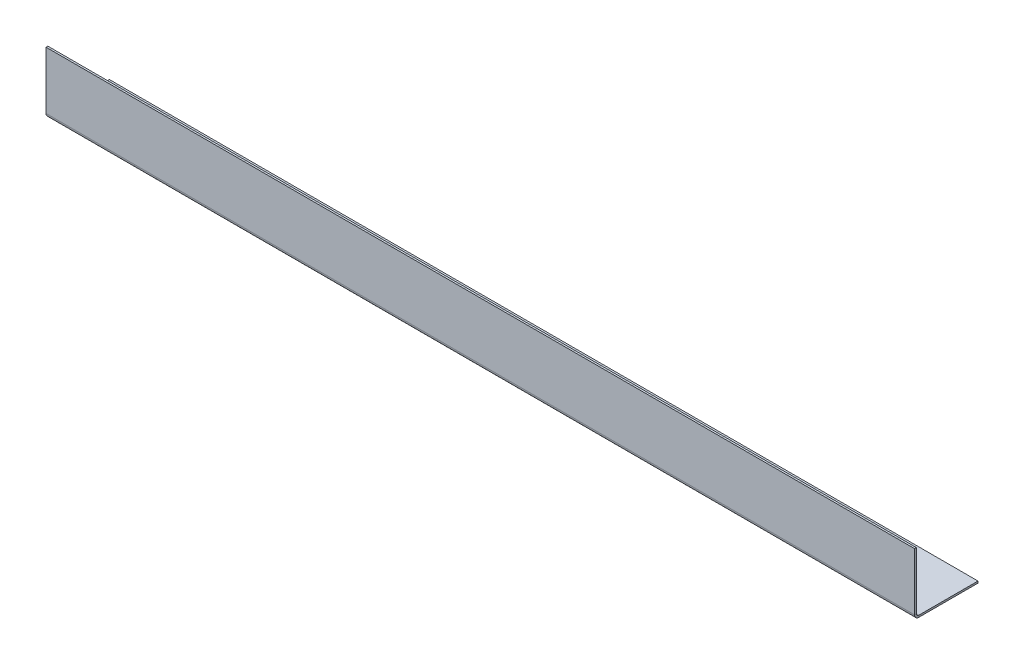
ISO-10303-21;
HEADER;
FILE_DESCRIPTION(('STEP AP214'),'2;1');
FILE_NAME('part.step','',(''),(''),'','','');
FILE_SCHEMA(('AUTOMOTIVE_DESIGN { 1 0 10303 214 1 1 1 1 }'));
ENDSEC;
DATA;
#1=APPLICATION_CONTEXT('core data for automotive mechanical design processes');
#2=APPLICATION_PROTOCOL_DEFINITION('international standard','automotive_design',2000,#1);
#3=PRODUCT_CONTEXT('',#1,'mechanical');
#4=PRODUCT('Part','Part','',(#3));
#5=PRODUCT_RELATED_PRODUCT_CATEGORY('part','',(#4));
#6=PRODUCT_DEFINITION_FORMATION('','',#4);
#7=PRODUCT_DEFINITION_CONTEXT('part definition',#1,'design');
#8=PRODUCT_DEFINITION('design','',#6,#7);
#9=PRODUCT_DEFINITION_SHAPE('','',#8);
#10=(LENGTH_UNIT() NAMED_UNIT(*) SI_UNIT(.MILLI.,.METRE.));
#11=(NAMED_UNIT(*) PLANE_ANGLE_UNIT() SI_UNIT($,.RADIAN.));
#12=(NAMED_UNIT(*) SI_UNIT($,.STERADIAN.) SOLID_ANGLE_UNIT());
#13=UNCERTAINTY_MEASURE_WITH_UNIT(LENGTH_MEASURE(1.E-05),#10,'distance_accuracy_value','');
#14=(GEOMETRIC_REPRESENTATION_CONTEXT(3) GLOBAL_UNCERTAINTY_ASSIGNED_CONTEXT((#13)) GLOBAL_UNIT_ASSIGNED_CONTEXT((#10,
#11,#12)) REPRESENTATION_CONTEXT('',''));
#15=CARTESIAN_POINT('',(0.,0.,0.));
#16=DIRECTION('',(0.,0.,1.));
#17=DIRECTION('',(1.,0.,0.));
#18=AXIS2_PLACEMENT_3D('',#15,#16,#17);
#19=CARTESIAN_POINT('',(0.,2.,0.));
#20=DIRECTION('',(1.,0.,0.));
#21=DIRECTION('',(0.,0.,-1.));
#22=AXIS2_PLACEMENT_3D('',#19,#20,#21);
#23=PLANE('',#22);
#24=DIRECTION('',(0.,0.,-1.));
#25=VECTOR('',#24,1.);
#26=CARTESIAN_POINT('',(0.,2.,0.));
#27=LINE('',#26,#25);
#28=CARTESIAN_POINT('',(0.,2.,-2.));
#29=VERTEX_POINT('',#28);
#30=CARTESIAN_POINT('',(0.,2.,-50.));
#31=VERTEX_POINT('',#30);
#32=EDGE_CURVE('E169',#29,#31,#27,.T.);
#33=ORIENTED_EDGE('',*,*,#32,.F.);
#34=DIRECTION('',(0.,-1.,0.));
#35=VECTOR('',#34,1.);
#36=CARTESIAN_POINT('',(0.,2.,-2.));
#37=LINE('',#36,#35);
#38=CARTESIAN_POINT('',(0.,0.499999999999997,-2.));
#39=VERTEX_POINT('',#38);
#40=EDGE_CURVE('E160',#29,#39,#37,.T.);
#41=ORIENTED_EDGE('',*,*,#40,.T.);
#42=DIRECTION('',(0.,0.,1.));
#43=VECTOR('',#42,1.);
#44=CARTESIAN_POINT('',(0.,0.5,0.));
#45=LINE('',#44,#43);
#46=CARTESIAN_POINT('',(0.,0.5,-50.));
#47=VERTEX_POINT('',#46);
#48=EDGE_CURVE('E167',#39,#47,#45,.F.);
#49=ORIENTED_EDGE('',*,*,#48,.T.);
#50=DIRECTION('',(0.,1.,0.));
#51=VECTOR('',#50,1.);
#52=CARTESIAN_POINT('',(0.,2.,-50.));
#53=LINE('',#52,#51);
#54=EDGE_CURVE('E45',#47,#31,#53,.T.);
#55=ORIENTED_EDGE('',*,*,#54,.T.);
#56=EDGE_LOOP('',(#33,#41,#49,#55));
#57=FACE_BOUND('',#56,.T.);
#58=ADVANCED_FACE('F41',(#57),#23,.T.);
#59=CARTESIAN_POINT('',(0.,2.,0.));
#60=DIRECTION('',(0.,1.,0.));
#61=DIRECTION('',(0.,0.,1.));
#62=AXIS2_PLACEMENT_3D('',#59,#60,#61);
#63=PLANE('',#62);
#64=DIRECTION('',(0.,0.,1.));
#65=VECTOR('',#64,1.);
#66=CARTESIAN_POINT('',(-705.,2.,0.));
#67=LINE('',#66,#65);
#68=CARTESIAN_POINT('',(-705.,2.,-49.9999999999999));
#69=VERTEX_POINT('',#68);
#70=CARTESIAN_POINT('',(-705.,2.,-2.));
#71=VERTEX_POINT('',#70);
#72=EDGE_CURVE('E175',#69,#71,#67,.T.);
#73=ORIENTED_EDGE('',*,*,#72,.T.);
#74=DIRECTION('',(1.,0.,0.));
#75=VECTOR('',#74,1.);
#76=CARTESIAN_POINT('',(0.,2.,-2.));
#77=LINE('',#76,#75);
#78=EDGE_CURVE('E63',#29,#71,#77,.F.);
#79=ORIENTED_EDGE('',*,*,#78,.F.);
#80=ORIENTED_EDGE('',*,*,#32,.T.);
#81=DIRECTION('',(-1.,0.,0.));
#82=VECTOR('',#81,1.);
#83=CARTESIAN_POINT('',(0.,2.,-50.));
#84=LINE('',#83,#82);
#85=EDGE_CURVE('E171',#31,#69,#84,.T.);
#86=ORIENTED_EDGE('',*,*,#85,.T.);
#87=EDGE_LOOP('',(#73,#79,#80,#86));
#88=FACE_BOUND('',#87,.T.);
#89=ADVANCED_FACE('F217',(#88),#63,.T.);
#90=CARTESIAN_POINT('',(0.,0.5,0.));
#91=DIRECTION('',(0.,1.,0.));
#92=DIRECTION('',(0.,0.,1.));
#93=AXIS2_PLACEMENT_3D('',#90,#91,#92);
#94=PLANE('',#93);
#95=DIRECTION('',(1.,0.,0.));
#96=VECTOR('',#95,1.);
#97=CARTESIAN_POINT('',(0.,0.499999999999997,-2.));
#98=LINE('',#97,#96);
#99=CARTESIAN_POINT('',(-705.,0.5,-2.));
#100=VERTEX_POINT('',#99);
#101=EDGE_CURVE('E114',#39,#100,#98,.F.);
#102=ORIENTED_EDGE('',*,*,#101,.T.);
#103=DIRECTION('',(0.,0.,1.));
#104=VECTOR('',#103,1.);
#105=CARTESIAN_POINT('',(-705.,0.5,0.));
#106=LINE('',#105,#104);
#107=CARTESIAN_POINT('',(-705.,0.5,-49.9999999999999));
#108=VERTEX_POINT('',#107);
#109=EDGE_CURVE('E172',#108,#100,#106,.T.);
#110=ORIENTED_EDGE('',*,*,#109,.F.);
#111=DIRECTION('',(1.,0.,0.));
#112=VECTOR('',#111,1.);
#113=CARTESIAN_POINT('',(0.,0.5,-50.));
#114=LINE('',#113,#112);
#115=EDGE_CURVE('E178',#47,#108,#114,.F.);
#116=ORIENTED_EDGE('',*,*,#115,.F.);
#117=ORIENTED_EDGE('',*,*,#48,.F.);
#118=EDGE_LOOP('',(#102,#110,#116,#117));
#119=FACE_BOUND('',#118,.T.);
#120=ADVANCED_FACE('F189',(#119),#94,.F.);
#121=CARTESIAN_POINT('',(-705.,2.,0.));
#122=DIRECTION('',(-1.,0.,0.));
#123=DIRECTION('',(0.,0.,1.));
#124=AXIS2_PLACEMENT_3D('',#121,#122,#123);
#125=PLANE('',#124);
#126=DIRECTION('',(0.,-1.,0.));
#127=VECTOR('',#126,1.);
#128=CARTESIAN_POINT('',(-705.,2.,-2.));
#129=LINE('',#128,#127);
#130=EDGE_CURVE('E56',#71,#100,#129,.T.);
#131=ORIENTED_EDGE('',*,*,#130,.F.);
#132=ORIENTED_EDGE('',*,*,#72,.F.);
#133=DIRECTION('',(0.,1.,0.));
#134=VECTOR('',#133,1.);
#135=CARTESIAN_POINT('',(-705.,2.,-49.9999999999999));
#136=LINE('',#135,#134);
#137=EDGE_CURVE('E11',#108,#69,#136,.T.);
#138=ORIENTED_EDGE('',*,*,#137,.F.);
#139=ORIENTED_EDGE('',*,*,#109,.T.);
#140=EDGE_LOOP('',(#131,#132,#138,#139));
#141=FACE_BOUND('',#140,.T.);
#142=ADVANCED_FACE('F190',(#141),#125,.T.);
#143=CARTESIAN_POINT('',(0.,2.,-50.));
#144=DIRECTION('',(0.,0.,-1.));
#145=DIRECTION('',(-1.,0.,0.));
#146=AXIS2_PLACEMENT_3D('',#143,#144,#145);
#147=PLANE('',#146);
#148=ORIENTED_EDGE('',*,*,#115,.T.);
#149=ORIENTED_EDGE('',*,*,#137,.T.);
#150=ORIENTED_EDGE('',*,*,#85,.F.);
#151=ORIENTED_EDGE('',*,*,#54,.F.);
#152=EDGE_LOOP('',(#148,#149,#150,#151));
#153=FACE_BOUND('',#152,.T.);
#154=ADVANCED_FACE('F43',(#153),#147,.T.);
#155=CARTESIAN_POINT('',(-705.,3.99999999999999,-2.));
#156=DIRECTION('',(-1.,0.,0.));
#157=DIRECTION('',(0.,0.,1.));
#158=AXIS2_PLACEMENT_3D('',#155,#156,#157);
#159=PLANE('',#158);
#160=DIRECTION('',(0.,0.,1.));
#161=VECTOR('',#160,1.);
#162=CARTESIAN_POINT('',(-705.,3.99999999999999,0.));
#163=LINE('',#162,#161);
#164=CARTESIAN_POINT('',(-705.,3.99999999999999,0.));
#165=VERTEX_POINT('',#164);
#166=CARTESIAN_POINT('',(-705.,3.99999999999999,1.5));
#167=VERTEX_POINT('',#166);
#168=EDGE_CURVE('E195',#165,#167,#163,.T.);
#169=ORIENTED_EDGE('',*,*,#168,.F.);
#170=CARTESIAN_POINT('',(-705.,3.99999999999999,-2.));
#171=DIRECTION('',(1.,0.,0.));
#172=DIRECTION('',(0.,0.,-1.));
#173=AXIS2_PLACEMENT_3D('',#170,#171,#172);
#174=CIRCLE('',#173,2.);
#175=EDGE_CURVE('E117',#71,#165,#174,.F.);
#176=ORIENTED_EDGE('',*,*,#175,.F.);
#177=ORIENTED_EDGE('',*,*,#130,.T.);
#178=CARTESIAN_POINT('',(-705.,3.99999999999999,-2.));
#179=DIRECTION('',(1.,0.,0.));
#180=DIRECTION('',(0.,0.,-1.));
#181=AXIS2_PLACEMENT_3D('',#178,#179,#180);
#182=CIRCLE('',#181,3.5);
#183=EDGE_CURVE('E159',#100,#167,#182,.F.);
#184=ORIENTED_EDGE('',*,*,#183,.T.);
#185=EDGE_LOOP('',(#169,#176,#177,#184));
#186=FACE_BOUND('',#185,.T.);
#187=ADVANCED_FACE('F193',(#186),#159,.T.);
#188=CARTESIAN_POINT('',(0.,3.99999999999999,-2.));
#189=DIRECTION('',(-1.,0.,0.));
#190=DIRECTION('',(0.,0.,1.));
#191=AXIS2_PLACEMENT_3D('',#188,#189,#190);
#192=PLANE('',#191);
#193=CARTESIAN_POINT('',(0.,3.99999999999999,-2.));
#194=DIRECTION('',(1.,0.,0.));
#195=DIRECTION('',(0.,0.,-1.));
#196=AXIS2_PLACEMENT_3D('',#193,#194,#195);
#197=CIRCLE('',#196,2.);
#198=CARTESIAN_POINT('',(0.,3.99999999999999,0.));
#199=VERTEX_POINT('',#198);
#200=EDGE_CURVE('E124',#199,#29,#197,.T.);
#201=ORIENTED_EDGE('',*,*,#200,.F.);
#202=DIRECTION('',(0.,0.,1.));
#203=VECTOR('',#202,1.);
#204=CARTESIAN_POINT('',(0.,3.99999999999999,0.));
#205=LINE('',#204,#203);
#206=CARTESIAN_POINT('',(0.,3.99999999999999,1.5));
#207=VERTEX_POINT('',#206);
#208=EDGE_CURVE('E121',#199,#207,#205,.T.);
#209=ORIENTED_EDGE('',*,*,#208,.T.);
#210=CARTESIAN_POINT('',(0.,3.99999999999999,-2.));
#211=DIRECTION('',(1.,0.,0.));
#212=DIRECTION('',(0.,0.,-1.));
#213=AXIS2_PLACEMENT_3D('',#210,#211,#212);
#214=CIRCLE('',#213,3.5);
#215=EDGE_CURVE('E107',#207,#39,#214,.T.);
#216=ORIENTED_EDGE('',*,*,#215,.T.);
#217=ORIENTED_EDGE('',*,*,#40,.F.);
#218=EDGE_LOOP('',(#201,#209,#216,#217));
#219=FACE_BOUND('',#218,.T.);
#220=ADVANCED_FACE('F122',(#219),#192,.F.);
#221=CARTESIAN_POINT('',(0.,3.99999999999999,-2.));
#222=DIRECTION('',(1.,0.,0.));
#223=DIRECTION('',(0.,0.,1.));
#224=AXIS2_PLACEMENT_3D('',#221,#222,#223);
#225=CYLINDRICAL_SURFACE('',#224,3.5);
#226=ORIENTED_EDGE('',*,*,#101,.F.);
#227=ORIENTED_EDGE('',*,*,#215,.F.);
#228=DIRECTION('',(-1.,0.,0.));
#229=VECTOR('',#228,1.);
#230=CARTESIAN_POINT('',(0.,3.99999999999999,1.5));
#231=LINE('',#230,#229);
#232=EDGE_CURVE('E112',#207,#167,#231,.T.);
#233=ORIENTED_EDGE('',*,*,#232,.T.);
#234=ORIENTED_EDGE('',*,*,#183,.F.);
#235=EDGE_LOOP('',(#226,#227,#233,#234));
#236=FACE_BOUND('',#235,.T.);
#237=ADVANCED_FACE('F109',(#236),#225,.T.);
#238=CARTESIAN_POINT('',(0.,3.99999999999999,-2.));
#239=DIRECTION('',(1.,0.,0.));
#240=DIRECTION('',(0.,0.,1.));
#241=AXIS2_PLACEMENT_3D('',#238,#239,#240);
#242=CYLINDRICAL_SURFACE('',#241,2.);
#243=ORIENTED_EDGE('',*,*,#78,.T.);
#244=ORIENTED_EDGE('',*,*,#175,.T.);
#245=DIRECTION('',(1.,0.,0.));
#246=VECTOR('',#245,1.);
#247=CARTESIAN_POINT('',(-705.,3.99999999999999,0.));
#248=LINE('',#247,#246);
#249=EDGE_CURVE('E128',#165,#199,#248,.T.);
#250=ORIENTED_EDGE('',*,*,#249,.T.);
#251=ORIENTED_EDGE('',*,*,#200,.T.);
#252=EDGE_LOOP('',(#243,#244,#250,#251));
#253=FACE_BOUND('',#252,.T.);
#254=ADVANCED_FACE('F198',(#253),#242,.F.);
#255=CARTESIAN_POINT('',(-705.,2.,1.5));
#256=DIRECTION('',(1.,0.,0.));
#257=DIRECTION('',(0.,0.,-1.));
#258=AXIS2_PLACEMENT_3D('',#255,#256,#257);
#259=PLANE('',#258);
#260=ORIENTED_EDGE('',*,*,#168,.T.);
#261=DIRECTION('',(0.,-1.,0.));
#262=VECTOR('',#261,1.);
#263=CARTESIAN_POINT('',(-705.,2.,1.5));
#264=LINE('',#263,#262);
#265=CARTESIAN_POINT('',(-705.,50.5,1.5));
#266=VERTEX_POINT('',#265);
#267=EDGE_CURVE('E136',#266,#167,#264,.T.);
#268=ORIENTED_EDGE('',*,*,#267,.F.);
#269=DIRECTION('',(0.,0.,-1.));
#270=VECTOR('',#269,1.);
#271=CARTESIAN_POINT('',(-705.,50.5,1.5));
#272=LINE('',#271,#270);
#273=CARTESIAN_POINT('',(-705.,50.5,0.));
#274=VERTEX_POINT('',#273);
#275=EDGE_CURVE('E145',#266,#274,#272,.T.);
#276=ORIENTED_EDGE('',*,*,#275,.T.);
#277=DIRECTION('',(0.,-1.,0.));
#278=VECTOR('',#277,1.);
#279=CARTESIAN_POINT('',(-705.,2.,0.));
#280=LINE('',#279,#278);
#281=EDGE_CURVE('E137',#274,#165,#280,.T.);
#282=ORIENTED_EDGE('',*,*,#281,.T.);
#283=EDGE_LOOP('',(#260,#268,#276,#282));
#284=FACE_BOUND('',#283,.T.);
#285=ADVANCED_FACE('F205',(#284),#259,.F.);
#286=CARTESIAN_POINT('',(0.,50.5,1.5));
#287=DIRECTION('',(-1.,0.,0.));
#288=DIRECTION('',(0.,0.,1.));
#289=AXIS2_PLACEMENT_3D('',#286,#287,#288);
#290=PLANE('',#289);
#291=ORIENTED_EDGE('',*,*,#208,.F.);
#292=DIRECTION('',(0.,1.,0.));
#293=VECTOR('',#292,1.);
#294=CARTESIAN_POINT('',(0.,50.5,0.));
#295=LINE('',#294,#293);
#296=CARTESIAN_POINT('',(0.,50.5,0.));
#297=VERTEX_POINT('',#296);
#298=EDGE_CURVE('E152',#199,#297,#295,.T.);
#299=ORIENTED_EDGE('',*,*,#298,.T.);
#300=DIRECTION('',(0.,0.,-1.));
#301=VECTOR('',#300,1.);
#302=CARTESIAN_POINT('',(0.,50.5,1.5));
#303=LINE('',#302,#301);
#304=CARTESIAN_POINT('',(0.,50.5,1.5));
#305=VERTEX_POINT('',#304);
#306=EDGE_CURVE('E141',#305,#297,#303,.T.);
#307=ORIENTED_EDGE('',*,*,#306,.F.);
#308=DIRECTION('',(0.,1.,0.));
#309=VECTOR('',#308,1.);
#310=CARTESIAN_POINT('',(0.,50.5,1.5));
#311=LINE('',#310,#309);
#312=EDGE_CURVE('E133',#207,#305,#311,.T.);
#313=ORIENTED_EDGE('',*,*,#312,.F.);
#314=EDGE_LOOP('',(#291,#299,#307,#313));
#315=FACE_BOUND('',#314,.T.);
#316=ADVANCED_FACE('F139',(#315),#290,.F.);
#317=CARTESIAN_POINT('',(0.,0.,1.5));
#318=DIRECTION('',(0.,0.,-1.));
#319=DIRECTION('',(-1.,0.,0.));
#320=AXIS2_PLACEMENT_3D('',#317,#318,#319);
#321=PLANE('',#320);
#322=ORIENTED_EDGE('',*,*,#232,.F.);
#323=ORIENTED_EDGE('',*,*,#312,.T.);
#324=DIRECTION('',(-1.,0.,0.));
#325=VECTOR('',#324,1.);
#326=CARTESIAN_POINT('',(-705.,50.5,1.5));
#327=LINE('',#326,#325);
#328=EDGE_CURVE('E143',#305,#266,#327,.T.);
#329=ORIENTED_EDGE('',*,*,#328,.T.);
#330=ORIENTED_EDGE('',*,*,#267,.T.);
#331=EDGE_LOOP('',(#322,#323,#329,#330));
#332=FACE_BOUND('',#331,.T.);
#333=ADVANCED_FACE('F132',(#332),#321,.F.);
#334=CARTESIAN_POINT('',(0.,0.,0.));
#335=DIRECTION('',(0.,0.,-1.));
#336=DIRECTION('',(-1.,0.,0.));
#337=AXIS2_PLACEMENT_3D('',#334,#335,#336);
#338=PLANE('',#337);
#339=ORIENTED_EDGE('',*,*,#298,.F.);
#340=ORIENTED_EDGE('',*,*,#249,.F.);
#341=ORIENTED_EDGE('',*,*,#281,.F.);
#342=DIRECTION('',(-1.,0.,0.));
#343=VECTOR('',#342,1.);
#344=CARTESIAN_POINT('',(-705.,50.5,0.));
#345=LINE('',#344,#343);
#346=EDGE_CURVE('E147',#297,#274,#345,.T.);
#347=ORIENTED_EDGE('',*,*,#346,.F.);
#348=EDGE_LOOP('',(#339,#340,#341,#347));
#349=FACE_BOUND('',#348,.T.);
#350=ADVANCED_FACE('F201',(#349),#338,.T.);
#351=CARTESIAN_POINT('',(-705.,50.5,1.5));
#352=DIRECTION('',(0.,-1.,0.));
#353=DIRECTION('',(0.,0.,-1.));
#354=AXIS2_PLACEMENT_3D('',#351,#352,#353);
#355=PLANE('',#354);
#356=ORIENTED_EDGE('',*,*,#346,.T.);
#357=ORIENTED_EDGE('',*,*,#275,.F.);
#358=ORIENTED_EDGE('',*,*,#328,.F.);
#359=ORIENTED_EDGE('',*,*,#306,.T.);
#360=EDGE_LOOP('',(#356,#357,#358,#359));
#361=FACE_BOUND('',#360,.T.);
#362=ADVANCED_FACE('F208',(#361),#355,.F.);
#363=CLOSED_SHELL('',(#58,#89,#120,#142,#154,#187,#220,#237,#254,#285,#316,#333,#350,#362));
#364=MANIFOLD_SOLID_BREP('B2',#363);
#365=ADVANCED_BREP_SHAPE_REPRESENTATION('',(#18,#364),#14);
#366=SHAPE_DEFINITION_REPRESENTATION(#9,#365);
ENDSEC;
END-ISO-10303-21;
